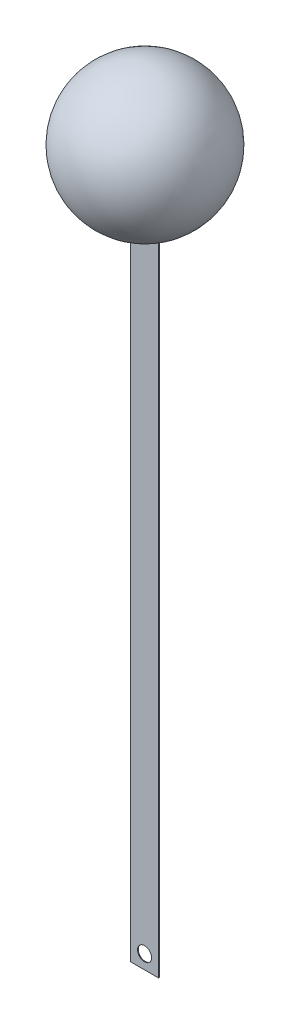
ISO-10303-21;
HEADER;
FILE_DESCRIPTION(('STEP AP214'),'2;1');
FILE_NAME('part.step','',(''),(''),'','','');
FILE_SCHEMA(('AUTOMOTIVE_DESIGN { 1 0 10303 214 1 1 1 1 }'));
ENDSEC;
DATA;
#1=APPLICATION_CONTEXT('core data for automotive mechanical design processes');
#2=APPLICATION_PROTOCOL_DEFINITION('international standard','automotive_design',2000,#1);
#3=PRODUCT_CONTEXT('',#1,'mechanical');
#4=PRODUCT('Part','Part','',(#3));
#5=PRODUCT_RELATED_PRODUCT_CATEGORY('part','',(#4));
#6=PRODUCT_DEFINITION_FORMATION('','',#4);
#7=PRODUCT_DEFINITION_CONTEXT('part definition',#1,'design');
#8=PRODUCT_DEFINITION('design','',#6,#7);
#9=PRODUCT_DEFINITION_SHAPE('','',#8);
#10=(LENGTH_UNIT() NAMED_UNIT(*) SI_UNIT(.MILLI.,.METRE.));
#11=(NAMED_UNIT(*) PLANE_ANGLE_UNIT() SI_UNIT($,.RADIAN.));
#12=(NAMED_UNIT(*) SI_UNIT($,.STERADIAN.) SOLID_ANGLE_UNIT());
#13=UNCERTAINTY_MEASURE_WITH_UNIT(LENGTH_MEASURE(1.E-05),#10,'distance_accuracy_value','');
#14=(GEOMETRIC_REPRESENTATION_CONTEXT(3) GLOBAL_UNCERTAINTY_ASSIGNED_CONTEXT((#13)) GLOBAL_UNIT_ASSIGNED_CONTEXT((#10,
#11,#12)) REPRESENTATION_CONTEXT('',''));
#15=CARTESIAN_POINT('',(0.,0.,0.));
#16=DIRECTION('',(0.,0.,1.));
#17=DIRECTION('',(1.,0.,0.));
#18=AXIS2_PLACEMENT_3D('',#15,#16,#17);
#19=CARTESIAN_POINT('',(0.,510.,0.));
#20=DIRECTION('',(0.,1.,0.));
#21=DIRECTION('',(1.,0.,0.));
#22=AXIS2_PLACEMENT_3D('',#19,#20,#21);
#23=SPHERICAL_SURFACE('',#22,50.);
#24=CARTESIAN_POINT('',(10.,510.,0.));
#25=DIRECTION('',(-1.,0.,0.));
#26=DIRECTION('',(0.,0.,1.));
#27=AXIS2_PLACEMENT_3D('',#24,#25,#26);
#28=CIRCLE('',#27,48.9897948556636);
#29=CARTESIAN_POINT('',(9.99999999999999,461.010843036443,0.25));
#30=VERTEX_POINT('',#29);
#31=CARTESIAN_POINT('',(9.99999999999999,461.010843036443,-0.25));
#32=VERTEX_POINT('',#31);
#33=EDGE_CURVE('E59',#30,#32,#28,.F.);
#34=ORIENTED_EDGE('',*,*,#33,.T.);
#35=CARTESIAN_POINT('',(0.,510.,-0.25));
#36=DIRECTION('',(0.,0.,1.));
#37=DIRECTION('',(1.,0.,0.));
#38=AXIS2_PLACEMENT_3D('',#35,#36,#37);
#39=CIRCLE('',#38,49.9993749960937);
#40=CARTESIAN_POINT('',(-10.,461.010843036443,-0.25));
#41=VERTEX_POINT('',#40);
#42=EDGE_CURVE('E63',#32,#41,#39,.F.);
#43=ORIENTED_EDGE('',*,*,#42,.T.);
#44=CARTESIAN_POINT('',(-10.,510.,0.));
#45=DIRECTION('',(1.,0.,0.));
#46=DIRECTION('',(0.,0.,-1.));
#47=AXIS2_PLACEMENT_3D('',#44,#45,#46);
#48=CIRCLE('',#47,48.9897948556636);
#49=CARTESIAN_POINT('',(-10.,461.010843036443,0.25));
#50=VERTEX_POINT('',#49);
#51=EDGE_CURVE('E52',#41,#50,#48,.F.);
#52=ORIENTED_EDGE('',*,*,#51,.T.);
#53=CARTESIAN_POINT('',(0.,510.,0.25));
#54=DIRECTION('',(0.,0.,-1.));
#55=DIRECTION('',(-1.,0.,0.));
#56=AXIS2_PLACEMENT_3D('',#53,#54,#55);
#57=CIRCLE('',#56,49.9993749960937);
#58=EDGE_CURVE('E11',#50,#30,#57,.F.);
#59=ORIENTED_EDGE('',*,*,#58,.T.);
#60=EDGE_LOOP('',(#34,#43,#52,#59));
#61=FACE_BOUND('',#60,.T.);
#62=ADVANCED_FACE('F43',(#61),#23,.T.);
#63=CARTESIAN_POINT('',(10.,560.001,0.25));
#64=DIRECTION('',(-1.,0.,0.));
#65=DIRECTION('',(0.,0.,1.));
#66=AXIS2_PLACEMENT_3D('',#63,#64,#65);
#67=PLANE('',#66);
#68=ORIENTED_EDGE('',*,*,#33,.F.);
#69=DIRECTION('',(0.,-1.,0.));
#70=VECTOR('',#69,1.);
#71=CARTESIAN_POINT('',(10.,560.001,0.25));
#72=LINE('',#71,#70);
#73=CARTESIAN_POINT('',(10.,0.,0.25));
#74=VERTEX_POINT('',#73);
#75=EDGE_CURVE('E99',#30,#74,#72,.T.);
#76=ORIENTED_EDGE('',*,*,#75,.T.);
#77=DIRECTION('',(0.,0.,-1.));
#78=VECTOR('',#77,1.);
#79=CARTESIAN_POINT('',(10.,0.,0.25));
#80=LINE('',#79,#78);
#81=CARTESIAN_POINT('',(10.,0.,-0.25));
#82=VERTEX_POINT('',#81);
#83=EDGE_CURVE('E104',#74,#82,#80,.T.);
#84=ORIENTED_EDGE('',*,*,#83,.T.);
#85=DIRECTION('',(0.,-1.,0.));
#86=VECTOR('',#85,1.);
#87=CARTESIAN_POINT('',(10.,560.001,-0.25));
#88=LINE('',#87,#86);
#89=EDGE_CURVE('E109',#32,#82,#88,.T.);
#90=ORIENTED_EDGE('',*,*,#89,.F.);
#91=EDGE_LOOP('',(#68,#76,#84,#90));
#92=FACE_BOUND('',#91,.T.);
#93=ADVANCED_FACE('F135',(#92),#67,.F.);
#94=CARTESIAN_POINT('',(-10.,560.001,-0.25));
#95=DIRECTION('',(0.,0.,1.));
#96=DIRECTION('',(1.,0.,0.));
#97=AXIS2_PLACEMENT_3D('',#94,#95,#96);
#98=PLANE('',#97);
#99=CARTESIAN_POINT('',(0.,10.,-0.25));
#100=DIRECTION('',(0.,0.,1.));
#101=DIRECTION('',(1.,0.,0.));
#102=AXIS2_PLACEMENT_3D('',#99,#100,#101);
#103=CIRCLE('',#102,5.);
#104=CARTESIAN_POINT('',(5.,10.,-0.25));
#105=VERTEX_POINT('',#104);
#106=EDGE_CURVE('E105',#105,#105,#103,.T.);
#107=ORIENTED_EDGE('',*,*,#106,.T.);
#108=EDGE_LOOP('',(#107));
#109=FACE_BOUND('',#108,.T.);
#110=ORIENTED_EDGE('',*,*,#42,.F.);
#111=ORIENTED_EDGE('',*,*,#89,.T.);
#112=DIRECTION('',(-1.,0.,0.));
#113=VECTOR('',#112,1.);
#114=CARTESIAN_POINT('',(-10.,0.,-0.25));
#115=LINE('',#114,#113);
#116=CARTESIAN_POINT('',(-10.,0.,-0.25));
#117=VERTEX_POINT('',#116);
#118=EDGE_CURVE('E123',#82,#117,#115,.T.);
#119=ORIENTED_EDGE('',*,*,#118,.T.);
#120=DIRECTION('',(0.,-1.,0.));
#121=VECTOR('',#120,1.);
#122=CARTESIAN_POINT('',(-10.,560.001,-0.25));
#123=LINE('',#122,#121);
#124=EDGE_CURVE('E122',#41,#117,#123,.T.);
#125=ORIENTED_EDGE('',*,*,#124,.F.);
#126=EDGE_LOOP('',(#110,#111,#119,#125));
#127=FACE_BOUND('',#126,.T.);
#128=ADVANCED_FACE('F131',(#109,#127),#98,.F.);
#129=CARTESIAN_POINT('',(-10.,560.001,0.25));
#130=DIRECTION('',(1.,0.,0.));
#131=DIRECTION('',(0.,0.,-1.));
#132=AXIS2_PLACEMENT_3D('',#129,#130,#131);
#133=PLANE('',#132);
#134=ORIENTED_EDGE('',*,*,#51,.F.);
#135=ORIENTED_EDGE('',*,*,#124,.T.);
#136=DIRECTION('',(0.,0.,1.));
#137=VECTOR('',#136,1.);
#138=CARTESIAN_POINT('',(-10.,0.,0.25));
#139=LINE('',#138,#137);
#140=CARTESIAN_POINT('',(-10.,0.,0.25));
#141=VERTEX_POINT('',#140);
#142=EDGE_CURVE('E90',#117,#141,#139,.T.);
#143=ORIENTED_EDGE('',*,*,#142,.T.);
#144=DIRECTION('',(0.,-1.,0.));
#145=VECTOR('',#144,1.);
#146=CARTESIAN_POINT('',(-10.,560.001,0.25));
#147=LINE('',#146,#145);
#148=EDGE_CURVE('E87',#50,#141,#147,.T.);
#149=ORIENTED_EDGE('',*,*,#148,.F.);
#150=EDGE_LOOP('',(#134,#135,#143,#149));
#151=FACE_BOUND('',#150,.T.);
#152=ADVANCED_FACE('F88',(#151),#133,.F.);
#153=CARTESIAN_POINT('',(-10.,560.001,0.25));
#154=DIRECTION('',(0.,0.,-1.));
#155=DIRECTION('',(-1.,0.,0.));
#156=AXIS2_PLACEMENT_3D('',#153,#154,#155);
#157=PLANE('',#156);
#158=CARTESIAN_POINT('',(0.,10.,0.25));
#159=DIRECTION('',(0.,0.,-1.));
#160=DIRECTION('',(-1.,0.,0.));
#161=AXIS2_PLACEMENT_3D('',#158,#159,#160);
#162=CIRCLE('',#161,5.);
#163=CARTESIAN_POINT('',(-5.,10.,0.25));
#164=VERTEX_POINT('',#163);
#165=EDGE_CURVE('E46',#164,#164,#162,.T.);
#166=ORIENTED_EDGE('',*,*,#165,.T.);
#167=EDGE_LOOP('',(#166));
#168=FACE_BOUND('',#167,.T.);
#169=ORIENTED_EDGE('',*,*,#58,.F.);
#170=ORIENTED_EDGE('',*,*,#148,.T.);
#171=DIRECTION('',(1.,0.,0.));
#172=VECTOR('',#171,1.);
#173=CARTESIAN_POINT('',(-10.,0.,0.25));
#174=LINE('',#173,#172);
#175=EDGE_CURVE('E95',#141,#74,#174,.T.);
#176=ORIENTED_EDGE('',*,*,#175,.T.);
#177=ORIENTED_EDGE('',*,*,#75,.F.);
#178=EDGE_LOOP('',(#169,#170,#176,#177));
#179=FACE_BOUND('',#178,.T.);
#180=ADVANCED_FACE('F98',(#168,#179),#157,.F.);
#181=CARTESIAN_POINT('',(0.,0.,0.));
#182=DIRECTION('',(0.,-1.,0.));
#183=DIRECTION('',(0.,0.,-1.));
#184=AXIS2_PLACEMENT_3D('',#181,#182,#183);
#185=PLANE('',#184);
#186=ORIENTED_EDGE('',*,*,#83,.F.);
#187=ORIENTED_EDGE('',*,*,#175,.F.);
#188=ORIENTED_EDGE('',*,*,#142,.F.);
#189=ORIENTED_EDGE('',*,*,#118,.F.);
#190=EDGE_LOOP('',(#186,#187,#188,#189));
#191=FACE_BOUND('',#190,.T.);
#192=ADVANCED_FACE('F134',(#191),#185,.T.);
#193=CARTESIAN_POINT('',(0.,10.,-50.));
#194=DIRECTION('',(0.,0.,1.));
#195=DIRECTION('',(1.,0.,0.));
#196=AXIS2_PLACEMENT_3D('',#193,#194,#195);
#197=CYLINDRICAL_SURFACE('',#196,5.);
#198=ORIENTED_EDGE('',*,*,#165,.F.);
#199=EDGE_LOOP('',(#198));
#200=FACE_BOUND('',#199,.T.);
#201=ORIENTED_EDGE('',*,*,#106,.F.);
#202=EDGE_LOOP('',(#201));
#203=FACE_BOUND('',#202,.T.);
#204=ADVANCED_FACE('F153',(#200,#203),#197,.F.);
#205=CLOSED_SHELL('',(#62,#93,#128,#152,#180,#192,#204));
#206=MANIFOLD_SOLID_BREP('B2',#205);
#207=ADVANCED_BREP_SHAPE_REPRESENTATION('',(#18,#206),#14);
#208=SHAPE_DEFINITION_REPRESENTATION(#9,#207);
ENDSEC;
END-ISO-10303-21;
